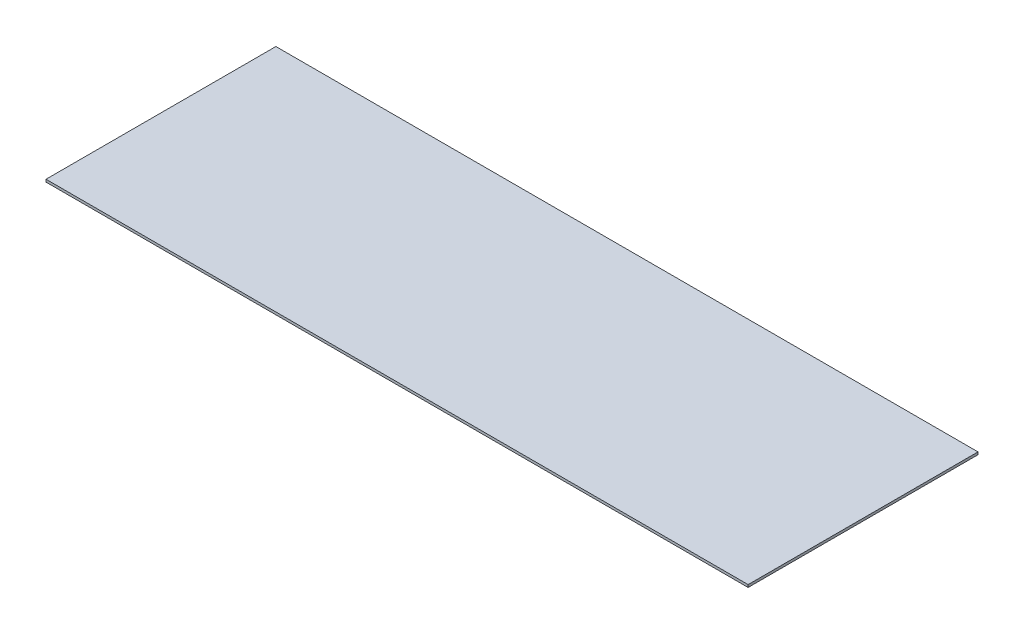
ISO-10303-21;
HEADER;
FILE_DESCRIPTION(('STEP AP214'),'2;1');
FILE_NAME('part.step','',(''),(''),'','','');
FILE_SCHEMA(('AUTOMOTIVE_DESIGN { 1 0 10303 214 1 1 1 1 }'));
ENDSEC;
DATA;
#1=APPLICATION_CONTEXT('core data for automotive mechanical design processes');
#2=APPLICATION_PROTOCOL_DEFINITION('international standard','automotive_design',2000,#1);
#3=PRODUCT_CONTEXT('',#1,'mechanical');
#4=PRODUCT('Part','Part','',(#3));
#5=PRODUCT_RELATED_PRODUCT_CATEGORY('part','',(#4));
#6=PRODUCT_DEFINITION_FORMATION('','',#4);
#7=PRODUCT_DEFINITION_CONTEXT('part definition',#1,'design');
#8=PRODUCT_DEFINITION('design','',#6,#7);
#9=PRODUCT_DEFINITION_SHAPE('','',#8);
#10=(LENGTH_UNIT() NAMED_UNIT(*) SI_UNIT(.MILLI.,.METRE.));
#11=(NAMED_UNIT(*) PLANE_ANGLE_UNIT() SI_UNIT($,.RADIAN.));
#12=(NAMED_UNIT(*) SI_UNIT($,.STERADIAN.) SOLID_ANGLE_UNIT());
#13=UNCERTAINTY_MEASURE_WITH_UNIT(LENGTH_MEASURE(1.E-05),#10,'distance_accuracy_value','');
#14=(GEOMETRIC_REPRESENTATION_CONTEXT(3) GLOBAL_UNCERTAINTY_ASSIGNED_CONTEXT((#13)) GLOBAL_UNIT_ASSIGNED_CONTEXT((#10,
#11,#12)) REPRESENTATION_CONTEXT('',''));
#15=CARTESIAN_POINT('',(0.,0.,0.));
#16=DIRECTION('',(0.,0.,1.));
#17=DIRECTION('',(1.,0.,0.));
#18=AXIS2_PLACEMENT_3D('',#15,#16,#17);
#19=CARTESIAN_POINT('',(446.0875,3.175,146.05));
#20=DIRECTION('',(-1.,0.,0.));
#21=DIRECTION('',(0.,0.,1.));
#22=AXIS2_PLACEMENT_3D('',#19,#20,#21);
#23=PLANE('',#22);
#24=DIRECTION('',(0.,0.,-1.));
#25=VECTOR('',#24,1.);
#26=CARTESIAN_POINT('',(446.0875,0.,146.05));
#27=LINE('',#26,#25);
#28=CARTESIAN_POINT('',(446.0875,0.,146.05));
#29=VERTEX_POINT('',#28);
#30=CARTESIAN_POINT('',(446.0875,0.,-146.05));
#31=VERTEX_POINT('',#30);
#32=EDGE_CURVE('E111',#29,#31,#27,.T.);
#33=ORIENTED_EDGE('',*,*,#32,.T.);
#34=DIRECTION('',(0.,-1.,0.));
#35=VECTOR('',#34,1.);
#36=CARTESIAN_POINT('',(446.0875,3.175,-146.05));
#37=LINE('',#36,#35);
#38=CARTESIAN_POINT('',(446.0875,3.175,-146.05));
#39=VERTEX_POINT('',#38);
#40=EDGE_CURVE('E11',#39,#31,#37,.T.);
#41=ORIENTED_EDGE('',*,*,#40,.F.);
#42=DIRECTION('',(0.,0.,-1.));
#43=VECTOR('',#42,1.);
#44=CARTESIAN_POINT('',(446.0875,3.175,146.05));
#45=LINE('',#44,#43);
#46=CARTESIAN_POINT('',(446.0875,3.175,146.05));
#47=VERTEX_POINT('',#46);
#48=EDGE_CURVE('E95',#47,#39,#45,.T.);
#49=ORIENTED_EDGE('',*,*,#48,.F.);
#50=DIRECTION('',(0.,-1.,0.));
#51=VECTOR('',#50,1.);
#52=CARTESIAN_POINT('',(446.0875,3.175,146.05));
#53=LINE('',#52,#51);
#54=EDGE_CURVE('E107',#47,#29,#53,.T.);
#55=ORIENTED_EDGE('',*,*,#54,.T.);
#56=EDGE_LOOP('',(#33,#41,#49,#55));
#57=FACE_BOUND('',#56,.T.);
#58=ADVANCED_FACE('F43',(#57),#23,.F.);
#59=CARTESIAN_POINT('',(-446.0875,3.175,-146.05));
#60=DIRECTION('',(0.,0.,1.));
#61=DIRECTION('',(1.,0.,0.));
#62=AXIS2_PLACEMENT_3D('',#59,#60,#61);
#63=PLANE('',#62);
#64=DIRECTION('',(-1.,0.,0.));
#65=VECTOR('',#64,1.);
#66=CARTESIAN_POINT('',(-446.0875,0.,-146.05));
#67=LINE('',#66,#65);
#68=CARTESIAN_POINT('',(-446.0875,0.,-146.05));
#69=VERTEX_POINT('',#68);
#70=EDGE_CURVE('E100',#31,#69,#67,.T.);
#71=ORIENTED_EDGE('',*,*,#70,.T.);
#72=DIRECTION('',(0.,-1.,0.));
#73=VECTOR('',#72,1.);
#74=CARTESIAN_POINT('',(-446.0875,3.175,-146.05));
#75=LINE('',#74,#73);
#76=CARTESIAN_POINT('',(-446.0875,3.175,-146.05));
#77=VERTEX_POINT('',#76);
#78=EDGE_CURVE('E52',#77,#69,#75,.T.);
#79=ORIENTED_EDGE('',*,*,#78,.F.);
#80=DIRECTION('',(-1.,0.,0.));
#81=VECTOR('',#80,1.);
#82=CARTESIAN_POINT('',(-446.0875,3.175,-146.05));
#83=LINE('',#82,#81);
#84=EDGE_CURVE('E90',#39,#77,#83,.T.);
#85=ORIENTED_EDGE('',*,*,#84,.F.);
#86=ORIENTED_EDGE('',*,*,#40,.T.);
#87=EDGE_LOOP('',(#71,#79,#85,#86));
#88=FACE_BOUND('',#87,.T.);
#89=ADVANCED_FACE('F99',(#88),#63,.F.);
#90=CARTESIAN_POINT('',(-446.0875,3.175,146.05));
#91=DIRECTION('',(1.,0.,0.));
#92=DIRECTION('',(0.,0.,-1.));
#93=AXIS2_PLACEMENT_3D('',#90,#91,#92);
#94=PLANE('',#93);
#95=DIRECTION('',(0.,0.,1.));
#96=VECTOR('',#95,1.);
#97=CARTESIAN_POINT('',(-446.0875,0.,146.05));
#98=LINE('',#97,#96);
#99=CARTESIAN_POINT('',(-446.0875,0.,146.05));
#100=VERTEX_POINT('',#99);
#101=EDGE_CURVE('E77',#69,#100,#98,.T.);
#102=ORIENTED_EDGE('',*,*,#101,.T.);
#103=DIRECTION('',(0.,-1.,0.));
#104=VECTOR('',#103,1.);
#105=CARTESIAN_POINT('',(-446.0875,3.175,146.05));
#106=LINE('',#105,#104);
#107=CARTESIAN_POINT('',(-446.0875,3.175,146.05));
#108=VERTEX_POINT('',#107);
#109=EDGE_CURVE('E102',#108,#100,#106,.T.);
#110=ORIENTED_EDGE('',*,*,#109,.F.);
#111=DIRECTION('',(0.,0.,1.));
#112=VECTOR('',#111,1.);
#113=CARTESIAN_POINT('',(-446.0875,3.175,146.05));
#114=LINE('',#113,#112);
#115=EDGE_CURVE('E93',#77,#108,#114,.T.);
#116=ORIENTED_EDGE('',*,*,#115,.F.);
#117=ORIENTED_EDGE('',*,*,#78,.T.);
#118=EDGE_LOOP('',(#102,#110,#116,#117));
#119=FACE_BOUND('',#118,.T.);
#120=ADVANCED_FACE('F103',(#119),#94,.F.);
#121=CARTESIAN_POINT('',(-446.0875,3.175,146.05));
#122=DIRECTION('',(0.,0.,-1.));
#123=DIRECTION('',(-1.,0.,0.));
#124=AXIS2_PLACEMENT_3D('',#121,#122,#123);
#125=PLANE('',#124);
#126=DIRECTION('',(1.,0.,0.));
#127=VECTOR('',#126,1.);
#128=CARTESIAN_POINT('',(-446.0875,0.,146.05));
#129=LINE('',#128,#127);
#130=EDGE_CURVE('E83',#100,#29,#129,.T.);
#131=ORIENTED_EDGE('',*,*,#130,.T.);
#132=ORIENTED_EDGE('',*,*,#54,.F.);
#133=DIRECTION('',(1.,0.,0.));
#134=VECTOR('',#133,1.);
#135=CARTESIAN_POINT('',(-446.0875,3.175,146.05));
#136=LINE('',#135,#134);
#137=EDGE_CURVE('E60',#108,#47,#136,.T.);
#138=ORIENTED_EDGE('',*,*,#137,.F.);
#139=ORIENTED_EDGE('',*,*,#109,.T.);
#140=EDGE_LOOP('',(#131,#132,#138,#139));
#141=FACE_BOUND('',#140,.T.);
#142=ADVANCED_FACE('F124',(#141),#125,.F.);
#143=CARTESIAN_POINT('',(0.,3.175,0.));
#144=DIRECTION('',(0.,-1.,0.));
#145=DIRECTION('',(0.,0.,-1.));
#146=AXIS2_PLACEMENT_3D('',#143,#144,#145);
#147=PLANE('',#146);
#148=ORIENTED_EDGE('',*,*,#48,.T.);
#149=ORIENTED_EDGE('',*,*,#84,.T.);
#150=ORIENTED_EDGE('',*,*,#115,.T.);
#151=ORIENTED_EDGE('',*,*,#137,.T.);
#152=EDGE_LOOP('',(#148,#149,#150,#151));
#153=FACE_BOUND('',#152,.T.);
#154=ADVANCED_FACE('F91',(#153),#147,.F.);
#155=CARTESIAN_POINT('',(0.,0.,0.));
#156=DIRECTION('',(0.,-1.,0.));
#157=DIRECTION('',(0.,0.,-1.));
#158=AXIS2_PLACEMENT_3D('',#155,#156,#157);
#159=PLANE('',#158);
#160=ORIENTED_EDGE('',*,*,#32,.F.);
#161=ORIENTED_EDGE('',*,*,#130,.F.);
#162=ORIENTED_EDGE('',*,*,#101,.F.);
#163=ORIENTED_EDGE('',*,*,#70,.F.);
#164=EDGE_LOOP('',(#160,#161,#162,#163));
#165=FACE_BOUND('',#164,.T.);
#166=ADVANCED_FACE('F127',(#165),#159,.T.);
#167=CLOSED_SHELL('',(#58,#89,#120,#142,#154,#166));
#168=MANIFOLD_SOLID_BREP('B2',#167);
#169=ADVANCED_BREP_SHAPE_REPRESENTATION('',(#18,#168),#14);
#170=SHAPE_DEFINITION_REPRESENTATION(#9,#169);
ENDSEC;
END-ISO-10303-21;
